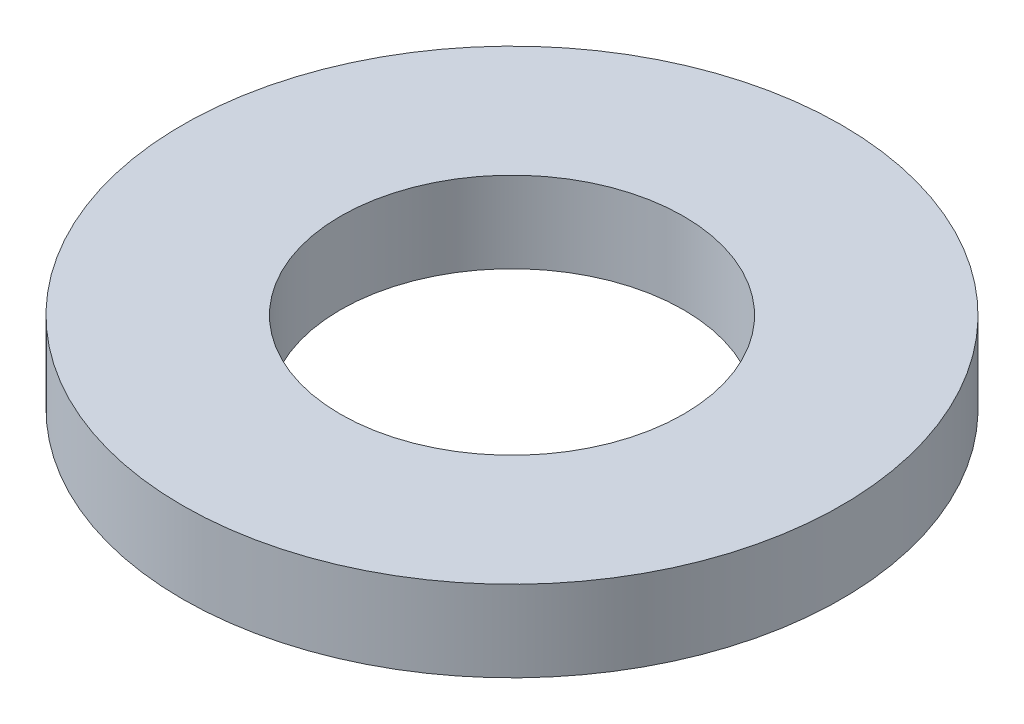
ISO-10303-21;
HEADER;
FILE_DESCRIPTION(('STEP AP214'),'2;1');
FILE_NAME('part.step','',(''),(''),'','','');
FILE_SCHEMA(('AUTOMOTIVE_DESIGN { 1 0 10303 214 1 1 1 1 }'));
ENDSEC;
DATA;
#1=APPLICATION_CONTEXT('core data for automotive mechanical design processes');
#2=APPLICATION_PROTOCOL_DEFINITION('international standard','automotive_design',2000,#1);
#3=PRODUCT_CONTEXT('',#1,'mechanical');
#4=PRODUCT('Part','Part','',(#3));
#5=PRODUCT_RELATED_PRODUCT_CATEGORY('part','',(#4));
#6=PRODUCT_DEFINITION_FORMATION('','',#4);
#7=PRODUCT_DEFINITION_CONTEXT('part definition',#1,'design');
#8=PRODUCT_DEFINITION('design','',#6,#7);
#9=PRODUCT_DEFINITION_SHAPE('','',#8);
#10=(LENGTH_UNIT() NAMED_UNIT(*) SI_UNIT(.MILLI.,.METRE.));
#11=(NAMED_UNIT(*) PLANE_ANGLE_UNIT() SI_UNIT($,.RADIAN.));
#12=(NAMED_UNIT(*) SI_UNIT($,.STERADIAN.) SOLID_ANGLE_UNIT());
#13=UNCERTAINTY_MEASURE_WITH_UNIT(LENGTH_MEASURE(1.E-05),#10,'distance_accuracy_value','');
#14=(GEOMETRIC_REPRESENTATION_CONTEXT(3) GLOBAL_UNCERTAINTY_ASSIGNED_CONTEXT((#13)) GLOBAL_UNIT_ASSIGNED_CONTEXT((#10,
#11,#12)) REPRESENTATION_CONTEXT('',''));
#15=CARTESIAN_POINT('',(0.,0.,0.));
#16=DIRECTION('',(0.,0.,1.));
#17=DIRECTION('',(1.,0.,0.));
#18=AXIS2_PLACEMENT_3D('',#15,#16,#17);
#19=CARTESIAN_POINT('',(0.,3.,0.));
#20=DIRECTION('',(0.,1.,0.));
#21=DIRECTION('',(0.,0.,1.));
#22=AXIS2_PLACEMENT_3D('',#19,#20,#21);
#23=PLANE('',#22);
#24=CARTESIAN_POINT('',(0.,3.,0.));
#25=DIRECTION('',(0.,1.,0.));
#26=DIRECTION('',(0.,0.,1.));
#27=AXIS2_PLACEMENT_3D('',#24,#25,#26);
#28=CIRCLE('',#27,12.2);
#29=CARTESIAN_POINT('',(0.,3.,12.2));
#30=VERTEX_POINT('',#29);
#31=EDGE_CURVE('E10',#30,#30,#28,.T.);
#32=ORIENTED_EDGE('',*,*,#31,.T.);
#33=EDGE_LOOP('',(#32));
#34=FACE_BOUND('',#33,.T.);
#35=CARTESIAN_POINT('',(0.,3.,0.));
#36=DIRECTION('',(0.,1.,0.));
#37=DIRECTION('',(0.,0.,1.));
#38=AXIS2_PLACEMENT_3D('',#35,#36,#37);
#39=CIRCLE('',#38,6.35);
#40=CARTESIAN_POINT('',(0.,3.,6.35));
#41=VERTEX_POINT('',#40);
#42=EDGE_CURVE('E44',#41,#41,#39,.T.);
#43=ORIENTED_EDGE('',*,*,#42,.F.);
#44=EDGE_LOOP('',(#43));
#45=FACE_BOUND('',#44,.T.);
#46=ADVANCED_FACE('F33',(#34,#45),#23,.T.);
#47=CARTESIAN_POINT('',(0.,0.,0.));
#48=DIRECTION('',(0.,1.,0.));
#49=DIRECTION('',(0.,0.,1.));
#50=AXIS2_PLACEMENT_3D('',#47,#48,#49);
#51=PLANE('',#50);
#52=CARTESIAN_POINT('',(0.,0.,0.));
#53=DIRECTION('',(0.,1.,0.));
#54=DIRECTION('',(0.,0.,1.));
#55=AXIS2_PLACEMENT_3D('',#52,#53,#54);
#56=CIRCLE('',#55,12.2);
#57=CARTESIAN_POINT('',(0.,0.,12.2));
#58=VERTEX_POINT('',#57);
#59=EDGE_CURVE('E37',#58,#58,#56,.T.);
#60=ORIENTED_EDGE('',*,*,#59,.F.);
#61=EDGE_LOOP('',(#60));
#62=FACE_BOUND('',#61,.T.);
#63=CARTESIAN_POINT('',(0.,0.,0.));
#64=DIRECTION('',(0.,1.,0.));
#65=DIRECTION('',(0.,0.,1.));
#66=AXIS2_PLACEMENT_3D('',#63,#64,#65);
#67=CIRCLE('',#66,6.35);
#68=CARTESIAN_POINT('',(0.,0.,6.35));
#69=VERTEX_POINT('',#68);
#70=EDGE_CURVE('E46',#69,#69,#67,.T.);
#71=ORIENTED_EDGE('',*,*,#70,.T.);
#72=EDGE_LOOP('',(#71));
#73=FACE_BOUND('',#72,.T.);
#74=ADVANCED_FACE('F56',(#62,#73),#51,.F.);
#75=CARTESIAN_POINT('',(0.,3.,0.));
#76=DIRECTION('',(0.,-1.,0.));
#77=DIRECTION('',(0.,0.,-1.));
#78=AXIS2_PLACEMENT_3D('',#75,#76,#77);
#79=CYLINDRICAL_SURFACE('',#78,12.2);
#80=ORIENTED_EDGE('',*,*,#31,.F.);
#81=EDGE_LOOP('',(#80));
#82=FACE_BOUND('',#81,.T.);
#83=ORIENTED_EDGE('',*,*,#59,.T.);
#84=EDGE_LOOP('',(#83));
#85=FACE_BOUND('',#84,.T.);
#86=ADVANCED_FACE('F35',(#82,#85),#79,.T.);
#87=CARTESIAN_POINT('',(0.,3.,0.));
#88=DIRECTION('',(0.,-1.,0.));
#89=DIRECTION('',(0.,0.,-1.));
#90=AXIS2_PLACEMENT_3D('',#87,#88,#89);
#91=CYLINDRICAL_SURFACE('',#90,6.35);
#92=ORIENTED_EDGE('',*,*,#42,.T.);
#93=EDGE_LOOP('',(#92));
#94=FACE_BOUND('',#93,.T.);
#95=ORIENTED_EDGE('',*,*,#70,.F.);
#96=EDGE_LOOP('',(#95));
#97=FACE_BOUND('',#96,.T.);
#98=ADVANCED_FACE('F52',(#94,#97),#91,.F.);
#99=CLOSED_SHELL('',(#46,#74,#86,#98));
#100=MANIFOLD_SOLID_BREP('B2',#99);
#101=ADVANCED_BREP_SHAPE_REPRESENTATION('',(#18,#100),#14);
#102=SHAPE_DEFINITION_REPRESENTATION(#9,#101);
ENDSEC;
END-ISO-10303-21;
